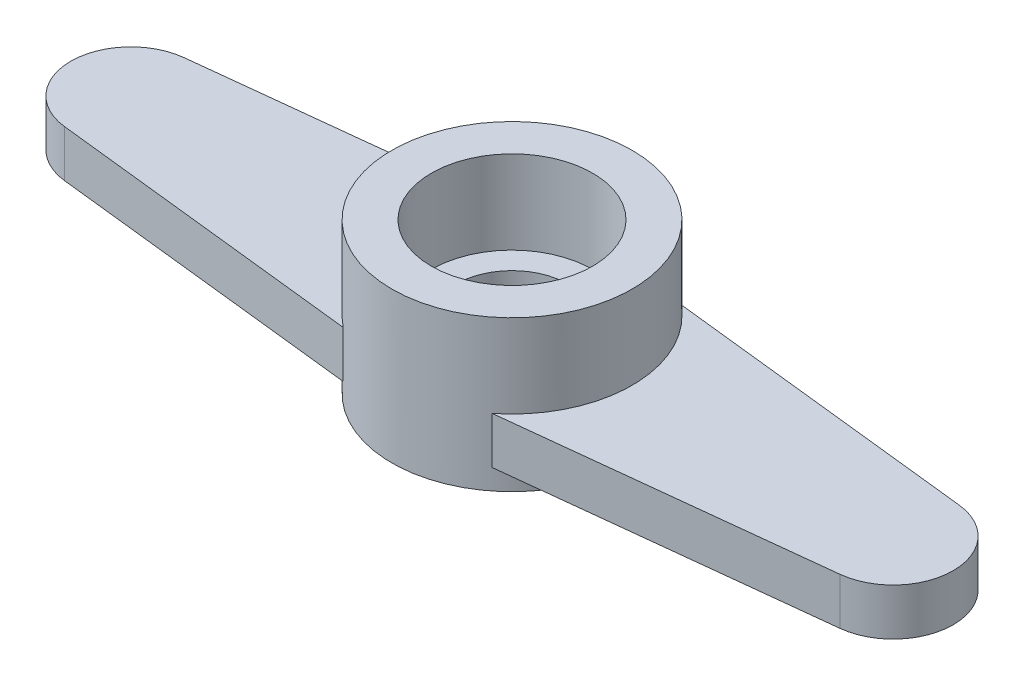
ISO-10303-21;
HEADER;
FILE_DESCRIPTION(('STEP AP214'),'2;1');
FILE_NAME('part.step','',(''),(''),'','','');
FILE_SCHEMA(('AUTOMOTIVE_DESIGN { 1 0 10303 214 1 1 1 1 }'));
ENDSEC;
DATA;
#1=APPLICATION_CONTEXT('core data for automotive mechanical design processes');
#2=APPLICATION_PROTOCOL_DEFINITION('international standard','automotive_design',2000,#1);
#3=PRODUCT_CONTEXT('',#1,'mechanical');
#4=PRODUCT('Part','Part','',(#3));
#5=PRODUCT_RELATED_PRODUCT_CATEGORY('part','',(#4));
#6=PRODUCT_DEFINITION_FORMATION('','',#4);
#7=PRODUCT_DEFINITION_CONTEXT('part definition',#1,'design');
#8=PRODUCT_DEFINITION('design','',#6,#7);
#9=PRODUCT_DEFINITION_SHAPE('','',#8);
#10=(LENGTH_UNIT() NAMED_UNIT(*) SI_UNIT(.MILLI.,.METRE.));
#11=(NAMED_UNIT(*) PLANE_ANGLE_UNIT() SI_UNIT($,.RADIAN.));
#12=(NAMED_UNIT(*) SI_UNIT($,.STERADIAN.) SOLID_ANGLE_UNIT());
#13=UNCERTAINTY_MEASURE_WITH_UNIT(LENGTH_MEASURE(1.E-05),#10,'distance_accuracy_value','');
#14=(GEOMETRIC_REPRESENTATION_CONTEXT(3) GLOBAL_UNCERTAINTY_ASSIGNED_CONTEXT((#13)) GLOBAL_UNIT_ASSIGNED_CONTEXT((#10,
#11,#12)) REPRESENTATION_CONTEXT('',''));
#15=CARTESIAN_POINT('',(0.,0.,0.));
#16=DIRECTION('',(0.,0.,1.));
#17=DIRECTION('',(1.,0.,0.));
#18=AXIS2_PLACEMENT_3D('',#15,#16,#17);
#19=CARTESIAN_POINT('',(0.,0.,0.));
#20=DIRECTION('',(0.,1.,0.));
#21=DIRECTION('',(0.,0.,1.));
#22=AXIS2_PLACEMENT_3D('',#19,#20,#21);
#23=PLANE('',#22);
#24=CARTESIAN_POINT('',(0.,0.,0.));
#25=DIRECTION('',(0.,-1.,0.));
#26=DIRECTION('',(0.,0.,-1.));
#27=AXIS2_PLACEMENT_3D('',#24,#25,#26);
#28=CIRCLE('',#27,3.95);
#29=CARTESIAN_POINT('',(2.44795833297874,0.,-3.1));
#30=VERTEX_POINT('',#29);
#31=CARTESIAN_POINT('',(2.44795833297873,0.,3.1));
#32=VERTEX_POINT('',#31);
#33=EDGE_CURVE('E137',#30,#32,#28,.T.);
#34=ORIENTED_EDGE('',*,*,#33,.F.);
#35=DIRECTION('',(0.993955849999221,0.,0.109780545873697));
#36=VECTOR('',#35,1.);
#37=CARTESIAN_POINT('',(0.367764975460945,0.,-3.329753426484));
#38=LINE('',#37,#36);
#39=CARTESIAN_POINT('',(12.7418165781006,0.,-1.96306280374846));
#40=VERTEX_POINT('',#39);
#41=EDGE_CURVE('E178',#30,#40,#38,.T.);
#42=ORIENTED_EDGE('',*,*,#41,.T.);
#43=CARTESIAN_POINT('',(12.525,0.,0.));
#44=DIRECTION('',(0.,1.,0.));
#45=DIRECTION('',(0.,0.,1.));
#46=AXIS2_PLACEMENT_3D('',#43,#44,#45);
#47=CIRCLE('',#46,1.975);
#48=CARTESIAN_POINT('',(12.7418165781006,0.,1.96306280374846));
#49=VERTEX_POINT('',#48);
#50=EDGE_CURVE('E117',#49,#40,#47,.T.);
#51=ORIENTED_EDGE('',*,*,#50,.F.);
#52=DIRECTION('',(0.993955849999221,0.,-0.109780545873697));
#53=VECTOR('',#52,1.);
#54=CARTESIAN_POINT('',(0.367764975460945,0.,3.329753426484));
#55=LINE('',#54,#53);
#56=EDGE_CURVE('E190',#32,#49,#55,.T.);
#57=ORIENTED_EDGE('',*,*,#56,.F.);
#58=EDGE_LOOP('',(#34,#42,#51,#57));
#59=FACE_BOUND('',#58,.T.);
#60=ADVANCED_FACE('F37',(#59),#23,.F.);
#61=CARTESIAN_POINT('',(-2.44795833297874,0.,3.1));
#62=VERTEX_POINT('',#61);
#63=CARTESIAN_POINT('',(-2.44795833297873,0.,-3.1));
#64=VERTEX_POINT('',#63);
#65=EDGE_CURVE('E11',#62,#64,#28,.T.);
#66=ORIENTED_EDGE('',*,*,#65,.F.);
#67=DIRECTION('',(-0.993955849999221,0.,-0.109780545873697));
#68=VECTOR('',#67,1.);
#69=CARTESIAN_POINT('',(-0.367764975460945,0.,3.329753426484));
#70=LINE('',#69,#68);
#71=CARTESIAN_POINT('',(-12.7418165781005,0.,1.96306280374846));
#72=VERTEX_POINT('',#71);
#73=EDGE_CURVE('E198',#62,#72,#70,.T.);
#74=ORIENTED_EDGE('',*,*,#73,.T.);
#75=CARTESIAN_POINT('',(-12.525,0.,0.));
#76=DIRECTION('',(0.,1.,0.));
#77=DIRECTION('',(0.,0.,1.));
#78=AXIS2_PLACEMENT_3D('',#75,#76,#77);
#79=CIRCLE('',#78,1.975);
#80=CARTESIAN_POINT('',(-12.7418165781005,0.,-1.96306280374846));
#81=VERTEX_POINT('',#80);
#82=EDGE_CURVE('E202',#72,#81,#79,.F.);
#83=ORIENTED_EDGE('',*,*,#82,.T.);
#84=DIRECTION('',(-0.993955849999221,0.,0.109780545873697));
#85=VECTOR('',#84,1.);
#86=CARTESIAN_POINT('',(-0.367764975460945,0.,-3.329753426484));
#87=LINE('',#86,#85);
#88=EDGE_CURVE('E147',#64,#81,#87,.T.);
#89=ORIENTED_EDGE('',*,*,#88,.F.);
#90=EDGE_LOOP('',(#66,#74,#83,#89));
#91=FACE_BOUND('',#90,.T.);
#92=ADVANCED_FACE('F217',(#91),#23,.F.);
#93=CARTESIAN_POINT('',(0.,1.54,0.));
#94=DIRECTION('',(0.,1.,0.));
#95=DIRECTION('',(0.,0.,1.));
#96=AXIS2_PLACEMENT_3D('',#93,#94,#95);
#97=PLANE('',#96);
#98=CARTESIAN_POINT('',(0.,1.54,0.));
#99=DIRECTION('',(0.,1.,0.));
#100=DIRECTION('',(0.,0.,1.));
#101=AXIS2_PLACEMENT_3D('',#98,#99,#100);
#102=CIRCLE('',#101,3.95);
#103=CARTESIAN_POINT('',(2.44795833297874,1.54,3.09999999999999));
#104=VERTEX_POINT('',#103);
#105=CARTESIAN_POINT('',(2.44795833297874,1.54,-3.1));
#106=VERTEX_POINT('',#105);
#107=EDGE_CURVE('E148',#104,#106,#102,.T.);
#108=ORIENTED_EDGE('',*,*,#107,.F.);
#109=DIRECTION('',(0.993955849999221,0.,-0.109780545873697));
#110=VECTOR('',#109,1.);
#111=CARTESIAN_POINT('',(0.367764975460945,1.54,3.329753426484));
#112=LINE('',#111,#110);
#113=CARTESIAN_POINT('',(12.7418165781006,1.54,1.96306280374846));
#114=VERTEX_POINT('',#113);
#115=EDGE_CURVE('E110',#104,#114,#112,.T.);
#116=ORIENTED_EDGE('',*,*,#115,.T.);
#117=CARTESIAN_POINT('',(12.525,1.54,0.));
#118=DIRECTION('',(0.,1.,0.));
#119=DIRECTION('',(0.,0.,1.));
#120=AXIS2_PLACEMENT_3D('',#117,#118,#119);
#121=CIRCLE('',#120,1.975);
#122=CARTESIAN_POINT('',(12.7418165781006,1.54,-1.96306280374846));
#123=VERTEX_POINT('',#122);
#124=EDGE_CURVE('E104',#114,#123,#121,.T.);
#125=ORIENTED_EDGE('',*,*,#124,.T.);
#126=DIRECTION('',(0.993955849999221,0.,0.109780545873697));
#127=VECTOR('',#126,1.);
#128=CARTESIAN_POINT('',(0.367764975460945,1.54,-3.329753426484));
#129=LINE('',#128,#127);
#130=EDGE_CURVE('E107',#106,#123,#129,.T.);
#131=ORIENTED_EDGE('',*,*,#130,.F.);
#132=EDGE_LOOP('',(#108,#116,#125,#131));
#133=FACE_BOUND('',#132,.T.);
#134=ADVANCED_FACE('F106',(#133),#97,.T.);
#135=CARTESIAN_POINT('',(-0.367764975460945,1.54,-3.329753426484));
#136=DIRECTION('',(0.109780545873697,0.,0.993955849999221));
#137=DIRECTION('',(0.993955849999221,0.,-0.109780545873697));
#138=AXIS2_PLACEMENT_3D('',#135,#136,#137);
#139=PLANE('',#138);
#140=ORIENTED_EDGE('',*,*,#88,.T.);
#141=DIRECTION('',(0.,-1.,0.));
#142=VECTOR('',#141,1.);
#143=CARTESIAN_POINT('',(-12.7418165781005,1.54,-1.96306280374846));
#144=LINE('',#143,#142);
#145=CARTESIAN_POINT('',(-12.7418165781005,1.54,-1.96306280374846));
#146=VERTEX_POINT('',#145);
#147=EDGE_CURVE('E155',#146,#81,#144,.T.);
#148=ORIENTED_EDGE('',*,*,#147,.F.);
#149=DIRECTION('',(-0.993955849999221,0.,0.109780545873697));
#150=VECTOR('',#149,1.);
#151=CARTESIAN_POINT('',(-0.367764975460945,1.54,-3.329753426484));
#152=LINE('',#151,#150);
#153=CARTESIAN_POINT('',(-2.44795833297873,1.54,-3.1));
#154=VERTEX_POINT('',#153);
#155=EDGE_CURVE('E88',#154,#146,#152,.T.);
#156=ORIENTED_EDGE('',*,*,#155,.F.);
#157=DIRECTION('',(0.,-1.,0.));
#158=VECTOR('',#157,1.);
#159=CARTESIAN_POINT('',(-2.44795833297873,1.54,-3.1));
#160=LINE('',#159,#158);
#161=EDGE_CURVE('E124',#154,#64,#160,.T.);
#162=ORIENTED_EDGE('',*,*,#161,.T.);
#163=EDGE_LOOP('',(#140,#148,#156,#162));
#164=FACE_BOUND('',#163,.T.);
#165=ADVANCED_FACE('F39',(#164),#139,.F.);
#166=CARTESIAN_POINT('',(-12.525,1.54,0.));
#167=DIRECTION('',(0.,-1.,0.));
#168=DIRECTION('',(0.,0.,-1.));
#169=AXIS2_PLACEMENT_3D('',#166,#167,#168);
#170=CYLINDRICAL_SURFACE('',#169,1.975);
#171=ORIENTED_EDGE('',*,*,#82,.F.);
#172=DIRECTION('',(0.,-1.,0.));
#173=VECTOR('',#172,1.);
#174=CARTESIAN_POINT('',(-12.7418165781005,1.54,1.96306280374846));
#175=LINE('',#174,#173);
#176=CARTESIAN_POINT('',(-12.7418165781005,1.54,1.96306280374846));
#177=VERTEX_POINT('',#176);
#178=EDGE_CURVE('E166',#177,#72,#175,.T.);
#179=ORIENTED_EDGE('',*,*,#178,.F.);
#180=CARTESIAN_POINT('',(-12.525,1.54,0.));
#181=DIRECTION('',(0.,1.,0.));
#182=DIRECTION('',(0.,0.,1.));
#183=AXIS2_PLACEMENT_3D('',#180,#181,#182);
#184=CIRCLE('',#183,1.975);
#185=EDGE_CURVE('E151',#177,#146,#184,.F.);
#186=ORIENTED_EDGE('',*,*,#185,.T.);
#187=ORIENTED_EDGE('',*,*,#147,.T.);
#188=EDGE_LOOP('',(#171,#179,#186,#187));
#189=FACE_BOUND('',#188,.T.);
#190=ADVANCED_FACE('F215',(#189),#170,.T.);
#191=CARTESIAN_POINT('',(-0.367764975460945,1.54,3.329753426484));
#192=DIRECTION('',(-0.109780545873697,0.,0.993955849999221));
#193=DIRECTION('',(0.993955849999221,0.,0.109780545873697));
#194=AXIS2_PLACEMENT_3D('',#191,#192,#193);
#195=PLANE('',#194);
#196=ORIENTED_EDGE('',*,*,#73,.F.);
#197=DIRECTION('',(0.,-1.,0.));
#198=VECTOR('',#197,1.);
#199=CARTESIAN_POINT('',(-2.44795833297873,1.54,3.1));
#200=LINE('',#199,#198);
#201=CARTESIAN_POINT('',(-2.44795833297873,1.54,3.1));
#202=VERTEX_POINT('',#201);
#203=EDGE_CURVE('E164',#202,#62,#200,.T.);
#204=ORIENTED_EDGE('',*,*,#203,.F.);
#205=DIRECTION('',(-0.993955849999221,0.,-0.109780545873697));
#206=VECTOR('',#205,1.);
#207=CARTESIAN_POINT('',(-0.367764975460945,1.54,3.329753426484));
#208=LINE('',#207,#206);
#209=EDGE_CURVE('E170',#202,#177,#208,.T.);
#210=ORIENTED_EDGE('',*,*,#209,.T.);
#211=ORIENTED_EDGE('',*,*,#178,.T.);
#212=EDGE_LOOP('',(#196,#204,#210,#211));
#213=FACE_BOUND('',#212,.T.);
#214=ADVANCED_FACE('F220',(#213),#195,.T.);
#215=CARTESIAN_POINT('',(0.367764975460945,1.54,3.329753426484));
#216=DIRECTION('',(-0.109780545873697,0.,-0.993955849999221));
#217=DIRECTION('',(-0.993955849999221,0.,0.109780545873697));
#218=AXIS2_PLACEMENT_3D('',#215,#216,#217);
#219=PLANE('',#218);
#220=ORIENTED_EDGE('',*,*,#56,.T.);
#221=DIRECTION('',(0.,-1.,0.));
#222=VECTOR('',#221,1.);
#223=CARTESIAN_POINT('',(12.7418165781006,1.54,1.96306280374846));
#224=LINE('',#223,#222);
#225=EDGE_CURVE('E119',#114,#49,#224,.T.);
#226=ORIENTED_EDGE('',*,*,#225,.F.);
#227=ORIENTED_EDGE('',*,*,#115,.F.);
#228=DIRECTION('',(0.,-1.,0.));
#229=VECTOR('',#228,1.);
#230=CARTESIAN_POINT('',(2.44795833297874,1.54,3.1));
#231=LINE('',#230,#229);
#232=EDGE_CURVE('E167',#104,#32,#231,.T.);
#233=ORIENTED_EDGE('',*,*,#232,.T.);
#234=EDGE_LOOP('',(#220,#226,#227,#233));
#235=FACE_BOUND('',#234,.T.);
#236=ADVANCED_FACE('F222',(#235),#219,.F.);
#237=CARTESIAN_POINT('',(12.525,1.54,0.));
#238=DIRECTION('',(0.,-1.,0.));
#239=DIRECTION('',(0.,0.,-1.));
#240=AXIS2_PLACEMENT_3D('',#237,#238,#239);
#241=CYLINDRICAL_SURFACE('',#240,1.975);
#242=ORIENTED_EDGE('',*,*,#50,.T.);
#243=DIRECTION('',(0.,-1.,0.));
#244=VECTOR('',#243,1.);
#245=CARTESIAN_POINT('',(12.7418165781006,1.54,-1.96306280374846));
#246=LINE('',#245,#244);
#247=EDGE_CURVE('E77',#123,#40,#246,.T.);
#248=ORIENTED_EDGE('',*,*,#247,.F.);
#249=ORIENTED_EDGE('',*,*,#124,.F.);
#250=ORIENTED_EDGE('',*,*,#225,.T.);
#251=EDGE_LOOP('',(#242,#248,#249,#250));
#252=FACE_BOUND('',#251,.T.);
#253=ADVANCED_FACE('F115',(#252),#241,.T.);
#254=CARTESIAN_POINT('',(0.367764975460945,1.54,-3.329753426484));
#255=DIRECTION('',(0.109780545873697,0.,-0.993955849999221));
#256=DIRECTION('',(-0.993955849999221,0.,-0.109780545873697));
#257=AXIS2_PLACEMENT_3D('',#254,#255,#256);
#258=PLANE('',#257);
#259=ORIENTED_EDGE('',*,*,#41,.F.);
#260=DIRECTION('',(0.,-1.,0.));
#261=VECTOR('',#260,1.);
#262=CARTESIAN_POINT('',(2.44795833297874,1.54,-3.1));
#263=LINE('',#262,#261);
#264=EDGE_CURVE('E120',#106,#30,#263,.T.);
#265=ORIENTED_EDGE('',*,*,#264,.F.);
#266=ORIENTED_EDGE('',*,*,#130,.T.);
#267=ORIENTED_EDGE('',*,*,#247,.T.);
#268=EDGE_LOOP('',(#259,#265,#266,#267));
#269=FACE_BOUND('',#268,.T.);
#270=ADVANCED_FACE('F122',(#269),#258,.T.);
#271=CARTESIAN_POINT('',(0.,1.54,0.));
#272=DIRECTION('',(0.,-1.,0.));
#273=DIRECTION('',(0.,0.,-1.));
#274=AXIS2_PLACEMENT_3D('',#271,#272,#273);
#275=CYLINDRICAL_SURFACE('',#274,3.95);
#276=ORIENTED_EDGE('',*,*,#33,.T.);
#277=ORIENTED_EDGE('',*,*,#232,.F.);
#278=ORIENTED_EDGE('',*,*,#107,.T.);
#279=ORIENTED_EDGE('',*,*,#264,.T.);
#280=EDGE_LOOP('',(#276,#277,#278,#279));
#281=FACE_BOUND('',#280,.T.);
#282=ORIENTED_EDGE('',*,*,#203,.T.);
#283=ORIENTED_EDGE('',*,*,#65,.T.);
#284=ORIENTED_EDGE('',*,*,#161,.F.);
#285=EDGE_CURVE('E47',#154,#202,#102,.T.);
#286=ORIENTED_EDGE('',*,*,#285,.T.);
#287=EDGE_LOOP('',(#282,#283,#284,#286));
#288=FACE_BOUND('',#287,.T.);
#289=CARTESIAN_POINT('',(0.,4.28,0.));
#290=DIRECTION('',(0.,1.,0.));
#291=DIRECTION('',(0.,0.,1.));
#292=AXIS2_PLACEMENT_3D('',#289,#290,#291);
#293=CIRCLE('',#292,3.95);
#294=CARTESIAN_POINT('',(0.,4.28,3.95));
#295=VERTEX_POINT('',#294);
#296=EDGE_CURVE('E144',#295,#295,#293,.T.);
#297=ORIENTED_EDGE('',*,*,#296,.F.);
#298=EDGE_LOOP('',(#297));
#299=FACE_BOUND('',#298,.T.);
#300=CARTESIAN_POINT('',(0.,-0.67,0.));
#301=DIRECTION('',(0.,-1.,0.));
#302=DIRECTION('',(0.,0.,-1.));
#303=AXIS2_PLACEMENT_3D('',#300,#301,#302);
#304=CIRCLE('',#303,3.95);
#305=CARTESIAN_POINT('',(0.,-0.67,-3.95));
#306=VERTEX_POINT('',#305);
#307=EDGE_CURVE('E141',#306,#306,#304,.T.);
#308=ORIENTED_EDGE('',*,*,#307,.F.);
#309=EDGE_LOOP('',(#308));
#310=FACE_BOUND('',#309,.T.);
#311=ADVANCED_FACE('F182',(#281,#288,#299,#310),#275,.T.);
#312=ORIENTED_EDGE('',*,*,#285,.F.);
#313=ORIENTED_EDGE('',*,*,#155,.T.);
#314=ORIENTED_EDGE('',*,*,#185,.F.);
#315=ORIENTED_EDGE('',*,*,#209,.F.);
#316=EDGE_LOOP('',(#312,#313,#314,#315));
#317=FACE_BOUND('',#316,.T.);
#318=ADVANCED_FACE('F237',(#317),#97,.T.);
#319=CARTESIAN_POINT('',(0.,4.28,0.));
#320=DIRECTION('',(0.,1.,0.));
#321=DIRECTION('',(0.,0.,1.));
#322=AXIS2_PLACEMENT_3D('',#319,#320,#321);
#323=PLANE('',#322);
#324=CARTESIAN_POINT('',(0.,4.28,0.));
#325=DIRECTION('',(0.,1.,0.));
#326=DIRECTION('',(0.,0.,1.));
#327=AXIS2_PLACEMENT_3D('',#324,#325,#326);
#328=CIRCLE('',#327,2.65);
#329=CARTESIAN_POINT('',(0.,4.28,2.65));
#330=VERTEX_POINT('',#329);
#331=EDGE_CURVE('E449',#330,#330,#328,.T.);
#332=ORIENTED_EDGE('',*,*,#331,.F.);
#333=EDGE_LOOP('',(#332));
#334=FACE_BOUND('',#333,.T.);
#335=ORIENTED_EDGE('',*,*,#296,.T.);
#336=EDGE_LOOP('',(#335));
#337=FACE_BOUND('',#336,.T.);
#338=ADVANCED_FACE('F265',(#334,#337),#323,.T.);
#339=CARTESIAN_POINT('',(0.,-0.67,0.));
#340=DIRECTION('',(0.,-1.,0.));
#341=DIRECTION('',(0.,0.,-1.));
#342=AXIS2_PLACEMENT_3D('',#339,#340,#341);
#343=PLANE('',#342);
#344=CARTESIAN_POINT('',(0.,-0.67,0.));
#345=DIRECTION('',(0.,-1.,0.));
#346=DIRECTION('',(0.,0.,-1.));
#347=AXIS2_PLACEMENT_3D('',#344,#345,#346);
#348=CIRCLE('',#347,3.45);
#349=CARTESIAN_POINT('',(0.,-0.67,-3.45));
#350=VERTEX_POINT('',#349);
#351=EDGE_CURVE('E441',#350,#350,#348,.T.);
#352=ORIENTED_EDGE('',*,*,#351,.F.);
#353=EDGE_LOOP('',(#352));
#354=FACE_BOUND('',#353,.T.);
#355=ORIENTED_EDGE('',*,*,#307,.T.);
#356=EDGE_LOOP('',(#355));
#357=FACE_BOUND('',#356,.T.);
#358=ADVANCED_FACE('F270',(#354,#357),#343,.T.);
#359=CARTESIAN_POINT('',(0.,-5.95533188057741,0.));
#360=DIRECTION('',(0.,1.,0.));
#361=DIRECTION('',(0.,0.,1.));
#362=AXIS2_PLACEMENT_3D('',#359,#360,#361);
#363=CYLINDRICAL_SURFACE('',#362,2.65);
#364=CARTESIAN_POINT('',(0.,1.54,0.));
#365=DIRECTION('',(0.,1.,0.));
#366=DIRECTION('',(0.,0.,1.));
#367=AXIS2_PLACEMENT_3D('',#364,#365,#366);
#368=CIRCLE('',#367,2.65);
#369=CARTESIAN_POINT('',(0.,1.54,2.65));
#370=VERTEX_POINT('',#369);
#371=EDGE_CURVE('E142',#370,#370,#368,.F.);
#372=ORIENTED_EDGE('',*,*,#371,.T.);
#373=EDGE_LOOP('',(#372));
#374=FACE_BOUND('',#373,.T.);
#375=ORIENTED_EDGE('',*,*,#331,.T.);
#376=EDGE_LOOP('',(#375));
#377=FACE_BOUND('',#376,.T.);
#378=ADVANCED_FACE('F278',(#374,#377),#363,.F.);
#379=CARTESIAN_POINT('',(0.,1.54,0.));
#380=DIRECTION('',(0.,1.,0.));
#381=DIRECTION('',(0.,0.,1.));
#382=AXIS2_PLACEMENT_3D('',#379,#380,#381);
#383=PLANE('',#382);
#384=CARTESIAN_POINT('',(0.,1.54,0.));
#385=DIRECTION('',(0.,1.,0.));
#386=DIRECTION('',(0.,0.,1.));
#387=AXIS2_PLACEMENT_3D('',#384,#385,#386);
#388=CIRCLE('',#387,1.825);
#389=CARTESIAN_POINT('',(0.,1.54,1.825));
#390=VERTEX_POINT('',#389);
#391=EDGE_CURVE('E438',#390,#390,#388,.T.);
#392=ORIENTED_EDGE('',*,*,#391,.F.);
#393=EDGE_LOOP('',(#392));
#394=FACE_BOUND('',#393,.T.);
#395=ORIENTED_EDGE('',*,*,#371,.F.);
#396=EDGE_LOOP('',(#395));
#397=FACE_BOUND('',#396,.T.);
#398=ADVANCED_FACE('F286',(#394,#397),#383,.T.);
#399=CARTESIAN_POINT('',(0.,0.,0.));
#400=DIRECTION('',(0.,1.,0.));
#401=DIRECTION('',(0.,0.,1.));
#402=AXIS2_PLACEMENT_3D('',#399,#400,#401);
#403=PLANE('',#402);
#404=CARTESIAN_POINT('',(0.,0.,0.));
#405=DIRECTION('',(0.,1.,0.));
#406=DIRECTION('',(0.,0.,1.));
#407=AXIS2_PLACEMENT_3D('',#404,#405,#406);
#408=CIRCLE('',#407,1.825);
#409=CARTESIAN_POINT('',(0.,0.,1.825));
#410=VERTEX_POINT('',#409);
#411=EDGE_CURVE('E41',#410,#410,#408,.T.);
#412=ORIENTED_EDGE('',*,*,#411,.T.);
#413=EDGE_LOOP('',(#412));
#414=FACE_BOUND('',#413,.T.);
#415=CARTESIAN_POINT('',(0.,0.,0.));
#416=DIRECTION('',(0.,1.,0.));
#417=DIRECTION('',(0.,0.,1.));
#418=AXIS2_PLACEMENT_3D('',#415,#416,#417);
#419=CIRCLE('',#418,3.45);
#420=CARTESIAN_POINT('',(0.,0.,3.45));
#421=VERTEX_POINT('',#420);
#422=EDGE_CURVE('E443',#421,#421,#419,.F.);
#423=ORIENTED_EDGE('',*,*,#422,.T.);
#424=EDGE_LOOP('',(#423));
#425=FACE_BOUND('',#424,.T.);
#426=ADVANCED_FACE('F294',(#414,#425),#403,.F.);
#427=CARTESIAN_POINT('',(0.,9.75807358037436,0.));
#428=DIRECTION('',(0.,-1.,0.));
#429=DIRECTION('',(0.,0.,-1.));
#430=AXIS2_PLACEMENT_3D('',#427,#428,#429);
#431=CYLINDRICAL_SURFACE('',#430,3.45);
#432=ORIENTED_EDGE('',*,*,#351,.T.);
#433=EDGE_LOOP('',(#432));
#434=FACE_BOUND('',#433,.T.);
#435=ORIENTED_EDGE('',*,*,#422,.F.);
#436=EDGE_LOOP('',(#435));
#437=FACE_BOUND('',#436,.T.);
#438=ADVANCED_FACE('F302',(#434,#437),#431,.F.);
#439=CARTESIAN_POINT('',(0.,-0.67,0.));
#440=DIRECTION('',(0.,1.,0.));
#441=DIRECTION('',(0.,0.,1.));
#442=AXIS2_PLACEMENT_3D('',#439,#440,#441);
#443=CYLINDRICAL_SURFACE('',#442,1.825);
#444=ORIENTED_EDGE('',*,*,#391,.T.);
#445=EDGE_LOOP('',(#444));
#446=FACE_BOUND('',#445,.T.);
#447=ORIENTED_EDGE('',*,*,#411,.F.);
#448=EDGE_LOOP('',(#447));
#449=FACE_BOUND('',#448,.T.);
#450=ADVANCED_FACE('F310',(#446,#449),#443,.F.);
#451=CLOSED_SHELL('',(#60,#92,#134,#165,#190,#214,#236,#253,#270,#311,#318,#338,#358,#378,#398,
#426,#438,#450));
#452=MANIFOLD_SOLID_BREP('B2',#451);
#453=ADVANCED_BREP_SHAPE_REPRESENTATION('',(#18,#452),#14);
#454=SHAPE_DEFINITION_REPRESENTATION(#9,#453);
ENDSEC;
END-ISO-10303-21;
